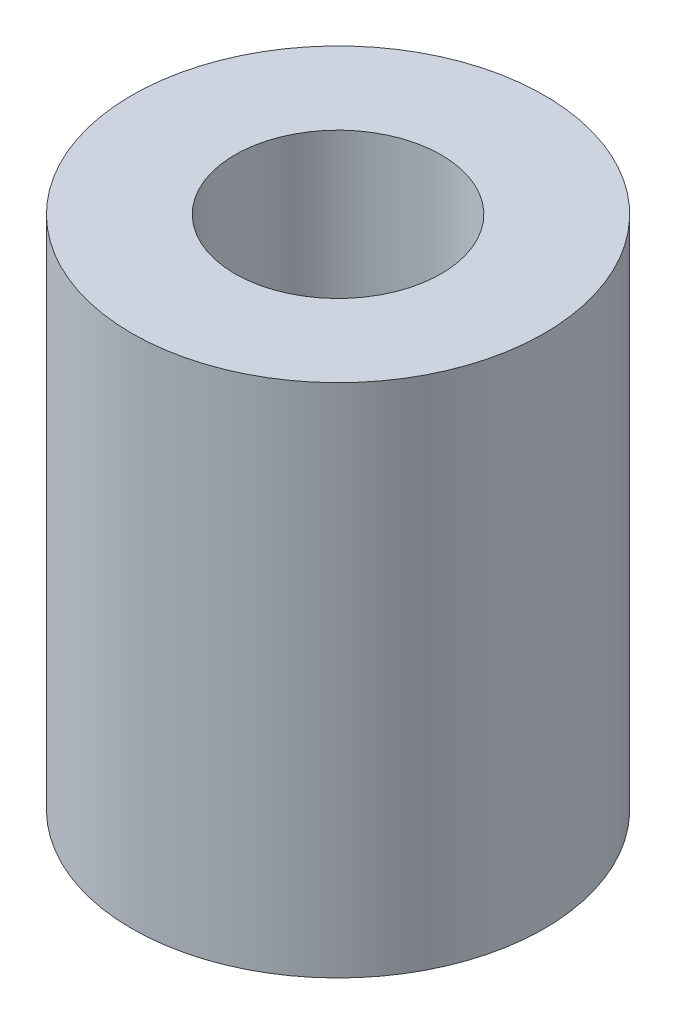
ISO-10303-21;
HEADER;
FILE_DESCRIPTION(('STEP AP214'),'2;1');
FILE_NAME('part.step','',(''),(''),'','','');
FILE_SCHEMA(('AUTOMOTIVE_DESIGN { 1 0 10303 214 1 1 1 1 }'));
ENDSEC;
DATA;
#1=APPLICATION_CONTEXT('core data for automotive mechanical design processes');
#2=APPLICATION_PROTOCOL_DEFINITION('international standard','automotive_design',2000,#1);
#3=PRODUCT_CONTEXT('',#1,'mechanical');
#4=PRODUCT('Part','Part','',(#3));
#5=PRODUCT_RELATED_PRODUCT_CATEGORY('part','',(#4));
#6=PRODUCT_DEFINITION_FORMATION('','',#4);
#7=PRODUCT_DEFINITION_CONTEXT('part definition',#1,'design');
#8=PRODUCT_DEFINITION('design','',#6,#7);
#9=PRODUCT_DEFINITION_SHAPE('','',#8);
#10=(LENGTH_UNIT() NAMED_UNIT(*) SI_UNIT(.MILLI.,.METRE.));
#11=(NAMED_UNIT(*) PLANE_ANGLE_UNIT() SI_UNIT($,.RADIAN.));
#12=(NAMED_UNIT(*) SI_UNIT($,.STERADIAN.) SOLID_ANGLE_UNIT());
#13=UNCERTAINTY_MEASURE_WITH_UNIT(LENGTH_MEASURE(1.E-05),#10,'distance_accuracy_value','');
#14=(GEOMETRIC_REPRESENTATION_CONTEXT(3) GLOBAL_UNCERTAINTY_ASSIGNED_CONTEXT((#13)) GLOBAL_UNIT_ASSIGNED_CONTEXT((#10,
#11,#12)) REPRESENTATION_CONTEXT('',''));
#15=CARTESIAN_POINT('',(0.,0.,0.));
#16=DIRECTION('',(0.,0.,1.));
#17=DIRECTION('',(1.,0.,0.));
#18=AXIS2_PLACEMENT_3D('',#15,#16,#17);
#19=CARTESIAN_POINT('',(0.,15.875,0.));
#20=DIRECTION('',(0.,-1.,0.));
#21=DIRECTION('',(0.,0.,-1.));
#22=AXIS2_PLACEMENT_3D('',#19,#20,#21);
#23=CYLINDRICAL_SURFACE('',#22,6.35);
#24=CARTESIAN_POINT('',(0.,15.875,0.));
#25=DIRECTION('',(0.,1.,0.));
#26=DIRECTION('',(0.,0.,1.));
#27=AXIS2_PLACEMENT_3D('',#24,#25,#26);
#28=CIRCLE('',#27,6.35);
#29=CARTESIAN_POINT('',(0.,15.875,6.35));
#30=VERTEX_POINT('',#29);
#31=EDGE_CURVE('E10',#30,#30,#28,.T.);
#32=ORIENTED_EDGE('',*,*,#31,.F.);
#33=EDGE_LOOP('',(#32));
#34=FACE_BOUND('',#33,.T.);
#35=CARTESIAN_POINT('',(0.,0.,0.));
#36=DIRECTION('',(0.,1.,0.));
#37=DIRECTION('',(0.,0.,1.));
#38=AXIS2_PLACEMENT_3D('',#35,#36,#37);
#39=CIRCLE('',#38,6.35);
#40=CARTESIAN_POINT('',(0.,0.,6.35));
#41=VERTEX_POINT('',#40);
#42=EDGE_CURVE('E34',#41,#41,#39,.T.);
#43=ORIENTED_EDGE('',*,*,#42,.T.);
#44=EDGE_LOOP('',(#43));
#45=FACE_BOUND('',#44,.T.);
#46=ADVANCED_FACE('F31',(#34,#45),#23,.T.);
#47=CARTESIAN_POINT('',(0.,15.875,0.));
#48=DIRECTION('',(0.,1.,0.));
#49=DIRECTION('',(0.,0.,1.));
#50=AXIS2_PLACEMENT_3D('',#47,#48,#49);
#51=PLANE('',#50);
#52=CARTESIAN_POINT('',(0.,15.875,0.));
#53=DIRECTION('',(0.,1.,0.));
#54=DIRECTION('',(0.,0.,1.));
#55=AXIS2_PLACEMENT_3D('',#52,#53,#54);
#56=CIRCLE('',#55,3.175);
#57=CARTESIAN_POINT('',(0.,15.875,3.175));
#58=VERTEX_POINT('',#57);
#59=EDGE_CURVE('E43',#58,#58,#56,.T.);
#60=ORIENTED_EDGE('',*,*,#59,.F.);
#61=EDGE_LOOP('',(#60));
#62=FACE_BOUND('',#61,.T.);
#63=ORIENTED_EDGE('',*,*,#31,.T.);
#64=EDGE_LOOP('',(#63));
#65=FACE_BOUND('',#64,.T.);
#66=ADVANCED_FACE('F58',(#62,#65),#51,.T.);
#67=CARTESIAN_POINT('',(0.,0.,0.));
#68=DIRECTION('',(0.,1.,0.));
#69=DIRECTION('',(0.,0.,1.));
#70=AXIS2_PLACEMENT_3D('',#67,#68,#69);
#71=PLANE('',#70);
#72=CARTESIAN_POINT('',(0.,0.,0.));
#73=DIRECTION('',(0.,1.,0.));
#74=DIRECTION('',(0.,0.,1.));
#75=AXIS2_PLACEMENT_3D('',#72,#73,#74);
#76=CIRCLE('',#75,3.175);
#77=CARTESIAN_POINT('',(0.,0.,3.175));
#78=VERTEX_POINT('',#77);
#79=EDGE_CURVE('E41',#78,#78,#76,.T.);
#80=ORIENTED_EDGE('',*,*,#79,.T.);
#81=EDGE_LOOP('',(#80));
#82=FACE_BOUND('',#81,.T.);
#83=ORIENTED_EDGE('',*,*,#42,.F.);
#84=EDGE_LOOP('',(#83));
#85=FACE_BOUND('',#84,.T.);
#86=ADVANCED_FACE('F49',(#82,#85),#71,.F.);
#87=CARTESIAN_POINT('',(0.,0.,0.));
#88=DIRECTION('',(0.,1.,0.));
#89=DIRECTION('',(0.,0.,1.));
#90=AXIS2_PLACEMENT_3D('',#87,#88,#89);
#91=CYLINDRICAL_SURFACE('',#90,3.175);
#92=ORIENTED_EDGE('',*,*,#79,.F.);
#93=EDGE_LOOP('',(#92));
#94=FACE_BOUND('',#93,.T.);
#95=ORIENTED_EDGE('',*,*,#59,.T.);
#96=EDGE_LOOP('',(#95));
#97=FACE_BOUND('',#96,.T.);
#98=ADVANCED_FACE('F52',(#94,#97),#91,.F.);
#99=CLOSED_SHELL('',(#46,#66,#86,#98));
#100=MANIFOLD_SOLID_BREP('B2',#99);
#101=ADVANCED_BREP_SHAPE_REPRESENTATION('',(#18,#100),#14);
#102=SHAPE_DEFINITION_REPRESENTATION(#9,#101);
ENDSEC;
END-ISO-10303-21;
